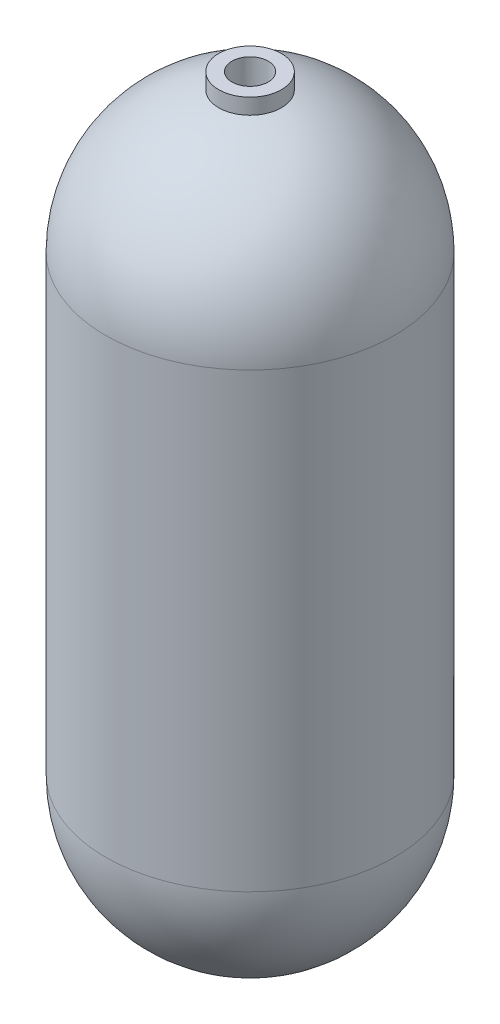
ISO-10303-21;
HEADER;
FILE_DESCRIPTION(('STEP AP214'),'2;1');
FILE_NAME('part.step','',(''),(''),'','','');
FILE_SCHEMA(('AUTOMOTIVE_DESIGN { 1 0 10303 214 1 1 1 1 }'));
ENDSEC;
DATA;
#1=APPLICATION_CONTEXT('core data for automotive mechanical design processes');
#2=APPLICATION_PROTOCOL_DEFINITION('international standard','automotive_design',2000,#1);
#3=PRODUCT_CONTEXT('',#1,'mechanical');
#4=PRODUCT('Part','Part','',(#3));
#5=PRODUCT_RELATED_PRODUCT_CATEGORY('part','',(#4));
#6=PRODUCT_DEFINITION_FORMATION('','',#4);
#7=PRODUCT_DEFINITION_CONTEXT('part definition',#1,'design');
#8=PRODUCT_DEFINITION('design','',#6,#7);
#9=PRODUCT_DEFINITION_SHAPE('','',#8);
#10=(LENGTH_UNIT() NAMED_UNIT(*) SI_UNIT(.MILLI.,.METRE.));
#11=(NAMED_UNIT(*) PLANE_ANGLE_UNIT() SI_UNIT($,.RADIAN.));
#12=(NAMED_UNIT(*) SI_UNIT($,.STERADIAN.) SOLID_ANGLE_UNIT());
#13=UNCERTAINTY_MEASURE_WITH_UNIT(LENGTH_MEASURE(1.E-05),#10,'distance_accuracy_value','');
#14=(GEOMETRIC_REPRESENTATION_CONTEXT(3) GLOBAL_UNCERTAINTY_ASSIGNED_CONTEXT((#13)) GLOBAL_UNIT_ASSIGNED_CONTEXT((#10,
#11,#12)) REPRESENTATION_CONTEXT('',''));
#15=CARTESIAN_POINT('',(0.,0.,0.));
#16=DIRECTION('',(0.,0.,1.));
#17=DIRECTION('',(1.,0.,0.));
#18=AXIS2_PLACEMENT_3D('',#15,#16,#17);
#19=CARTESIAN_POINT('',(6.35,63.3728585744349,0.));
#20=DIRECTION('',(0.,-1.,0.));
#21=DIRECTION('',(1.,0.,0.));
#22=AXIS2_PLACEMENT_3D('',#19,#20,#21);
#23=PLANE('',#22);
#24=CARTESIAN_POINT('',(0.,63.3728585744349,0.));
#25=DIRECTION('',(0.,1.,0.));
#26=DIRECTION('',(0.,0.,1.));
#27=AXIS2_PLACEMENT_3D('',#24,#25,#26);
#28=CIRCLE('',#27,7.34186999999999);
#29=CARTESIAN_POINT('',(0.,63.3728585744349,7.34186999999999));
#30=VERTEX_POINT('',#29);
#31=EDGE_CURVE('E59',#30,#30,#28,.T.);
#32=ORIENTED_EDGE('',*,*,#31,.F.);
#33=EDGE_LOOP('',(#32));
#34=FACE_BOUND('',#33,.T.);
#35=CARTESIAN_POINT('',(0.,63.3728585744349,0.));
#36=DIRECTION('',(0.,1.,0.));
#37=DIRECTION('',(-1.,0.,0.));
#38=AXIS2_PLACEMENT_3D('',#35,#36,#37);
#39=CIRCLE('',#38,12.7);
#40=CARTESIAN_POINT('',(-12.7,63.3728585744349,0.));
#41=VERTEX_POINT('',#40);
#42=EDGE_CURVE('E56',#41,#41,#39,.T.);
#43=ORIENTED_EDGE('',*,*,#42,.T.);
#44=EDGE_LOOP('',(#43));
#45=FACE_BOUND('',#44,.T.);
#46=ADVANCED_FACE('F34',(#34,#45),#23,.F.);
#47=CARTESIAN_POINT('',(0.,-183.007141425565,0.));
#48=DIRECTION('',(0.,1.,0.));
#49=DIRECTION('',(-1.,0.,0.));
#50=AXIS2_PLACEMENT_3D('',#47,#48,#49);
#51=SPHERICAL_SURFACE('',#50,58.42);
#52=CARTESIAN_POINT('',(0.,-183.007141425565,0.));
#53=DIRECTION('',(0.,1.,0.));
#54=DIRECTION('',(-1.,0.,0.));
#55=AXIS2_PLACEMENT_3D('',#52,#53,#54);
#56=CIRCLE('',#55,58.4200000000001);
#57=CARTESIAN_POINT('',(-58.4200000000001,-183.007141425565,0.));
#58=VERTEX_POINT('',#57);
#59=EDGE_CURVE('E45',#58,#58,#56,.T.);
#60=ORIENTED_EDGE('',*,*,#59,.F.);
#61=EDGE_LOOP('',(#60));
#62=FACE_BOUND('',#61,.T.);
#63=ADVANCED_FACE('F85',(#62),#51,.T.);
#64=CARTESIAN_POINT('',(0.,80.4478853232941,0.));
#65=DIRECTION('',(0.,1.,0.));
#66=DIRECTION('',(-1.,0.,0.));
#67=AXIS2_PLACEMENT_3D('',#64,#65,#66);
#68=CYLINDRICAL_SURFACE('',#67,58.42);
#69=CARTESIAN_POINT('',(0.,0.,0.));
#70=DIRECTION('',(0.,1.,0.));
#71=DIRECTION('',(-1.,0.,0.));
#72=AXIS2_PLACEMENT_3D('',#69,#70,#71);
#73=CIRCLE('',#72,58.42);
#74=CARTESIAN_POINT('',(-58.42,0.,0.));
#75=VERTEX_POINT('',#74);
#76=EDGE_CURVE('E50',#75,#75,#73,.T.);
#77=ORIENTED_EDGE('',*,*,#76,.F.);
#78=EDGE_LOOP('',(#77));
#79=FACE_BOUND('',#78,.T.);
#80=ORIENTED_EDGE('',*,*,#59,.T.);
#81=EDGE_LOOP('',(#80));
#82=FACE_BOUND('',#81,.T.);
#83=ADVANCED_FACE('F90',(#79,#82),#68,.T.);
#84=CARTESIAN_POINT('',(0.,0.,0.));
#85=DIRECTION('',(0.,1.,0.));
#86=DIRECTION('',(1.,0.,0.));
#87=AXIS2_PLACEMENT_3D('',#84,#85,#86);
#88=SPHERICAL_SURFACE('',#87,58.42);
#89=CARTESIAN_POINT('',(0.,57.0228585744349,0.));
#90=DIRECTION('',(0.,1.,0.));
#91=DIRECTION('',(-1.,0.,0.));
#92=AXIS2_PLACEMENT_3D('',#89,#90,#91);
#93=CIRCLE('',#92,12.7);
#94=CARTESIAN_POINT('',(-12.7,57.0228585744349,0.));
#95=VERTEX_POINT('',#94);
#96=EDGE_CURVE('E53',#95,#95,#93,.T.);
#97=ORIENTED_EDGE('',*,*,#96,.F.);
#98=EDGE_LOOP('',(#97));
#99=FACE_BOUND('',#98,.T.);
#100=ORIENTED_EDGE('',*,*,#76,.T.);
#101=EDGE_LOOP('',(#100));
#102=FACE_BOUND('',#101,.T.);
#103=ADVANCED_FACE('F81',(#99,#102),#88,.T.);
#104=CARTESIAN_POINT('',(0.,80.4478853232941,0.));
#105=DIRECTION('',(0.,1.,0.));
#106=DIRECTION('',(-1.,0.,0.));
#107=AXIS2_PLACEMENT_3D('',#104,#105,#106);
#108=CYLINDRICAL_SURFACE('',#107,12.7);
#109=ORIENTED_EDGE('',*,*,#42,.F.);
#110=EDGE_LOOP('',(#109));
#111=FACE_BOUND('',#110,.T.);
#112=ORIENTED_EDGE('',*,*,#96,.T.);
#113=EDGE_LOOP('',(#112));
#114=FACE_BOUND('',#113,.T.);
#115=ADVANCED_FACE('F72',(#111,#114),#108,.T.);
#116=CARTESIAN_POINT('',(0.,63.3728585744349,0.));
#117=DIRECTION('',(0.,1.,0.));
#118=DIRECTION('',(0.,0.,1.));
#119=AXIS2_PLACEMENT_3D('',#116,#117,#118);
#120=CYLINDRICAL_SURFACE('',#119,7.34186999999999);
#121=ORIENTED_EDGE('',*,*,#31,.T.);
#122=EDGE_LOOP('',(#121));
#123=FACE_BOUND('',#122,.T.);
#124=CARTESIAN_POINT('',(0.,51.5497996591946,0.));
#125=DIRECTION('',(0.,-1.,0.));
#126=DIRECTION('',(0.,0.,-1.));
#127=AXIS2_PLACEMENT_3D('',#124,#125,#126);
#128=CIRCLE('',#127,7.34186999999999);
#129=CARTESIAN_POINT('',(0.,51.5497996591946,-7.34186999999999));
#130=VERTEX_POINT('',#129);
#131=EDGE_CURVE('E37',#130,#130,#128,.F.);
#132=ORIENTED_EDGE('',*,*,#131,.F.);
#133=EDGE_LOOP('',(#132));
#134=FACE_BOUND('',#133,.T.);
#135=ADVANCED_FACE('F69',(#123,#134),#120,.F.);
#136=CARTESIAN_POINT('',(0.,-183.007141425565,0.));
#137=DIRECTION('',(0.,1.,0.));
#138=DIRECTION('',(1.,0.,0.));
#139=AXIS2_PLACEMENT_3D('',#136,#137,#138);
#140=SPHERICAL_SURFACE('',#139,52.07);
#141=CARTESIAN_POINT('',(0.,-183.007141425565,0.));
#142=DIRECTION('',(0.,1.,0.));
#143=DIRECTION('',(-1.,0.,0.));
#144=AXIS2_PLACEMENT_3D('',#141,#142,#143);
#145=CIRCLE('',#144,52.0700000000001);
#146=CARTESIAN_POINT('',(-52.0700000000001,-183.007141425565,0.));
#147=VERTEX_POINT('',#146);
#148=EDGE_CURVE('E41',#147,#147,#145,.T.);
#149=ORIENTED_EDGE('',*,*,#148,.T.);
#150=EDGE_LOOP('',(#149));
#151=FACE_BOUND('',#150,.T.);
#152=ADVANCED_FACE('F71',(#151),#140,.F.);
#153=CARTESIAN_POINT('',(0.,80.4478853232941,0.));
#154=DIRECTION('',(0.,1.,0.));
#155=DIRECTION('',(-1.,0.,0.));
#156=AXIS2_PLACEMENT_3D('',#153,#154,#155);
#157=CYLINDRICAL_SURFACE('',#156,52.0700000000001);
#158=ORIENTED_EDGE('',*,*,#148,.F.);
#159=EDGE_LOOP('',(#158));
#160=FACE_BOUND('',#159,.T.);
#161=CARTESIAN_POINT('',(0.,0.,0.));
#162=DIRECTION('',(0.,1.,0.));
#163=DIRECTION('',(-1.,0.,0.));
#164=AXIS2_PLACEMENT_3D('',#161,#162,#163);
#165=CIRCLE('',#164,52.07);
#166=CARTESIAN_POINT('',(-52.0700000000001,0.,0.));
#167=VERTEX_POINT('',#166);
#168=EDGE_CURVE('E10',#167,#167,#165,.T.);
#169=ORIENTED_EDGE('',*,*,#168,.T.);
#170=EDGE_LOOP('',(#169));
#171=FACE_BOUND('',#170,.T.);
#172=ADVANCED_FACE('F78',(#160,#171),#157,.F.);
#173=CARTESIAN_POINT('',(0.,0.,0.));
#174=DIRECTION('',(0.,1.,0.));
#175=DIRECTION('',(1.,0.,0.));
#176=AXIS2_PLACEMENT_3D('',#173,#174,#175);
#177=SPHERICAL_SURFACE('',#176,52.07);
#178=ORIENTED_EDGE('',*,*,#131,.T.);
#179=EDGE_LOOP('',(#178));
#180=FACE_BOUND('',#179,.T.);
#181=ORIENTED_EDGE('',*,*,#168,.F.);
#182=EDGE_LOOP('',(#181));
#183=FACE_BOUND('',#182,.T.);
#184=ADVANCED_FACE('F66',(#180,#183),#177,.F.);
#185=CLOSED_SHELL('',(#46,#63,#83,#103,#115,#135,#152,#172,#184));
#186=MANIFOLD_SOLID_BREP('B2',#185);
#187=ADVANCED_BREP_SHAPE_REPRESENTATION('',(#18,#186),#14);
#188=SHAPE_DEFINITION_REPRESENTATION(#9,#187);
ENDSEC;
END-ISO-10303-21;
